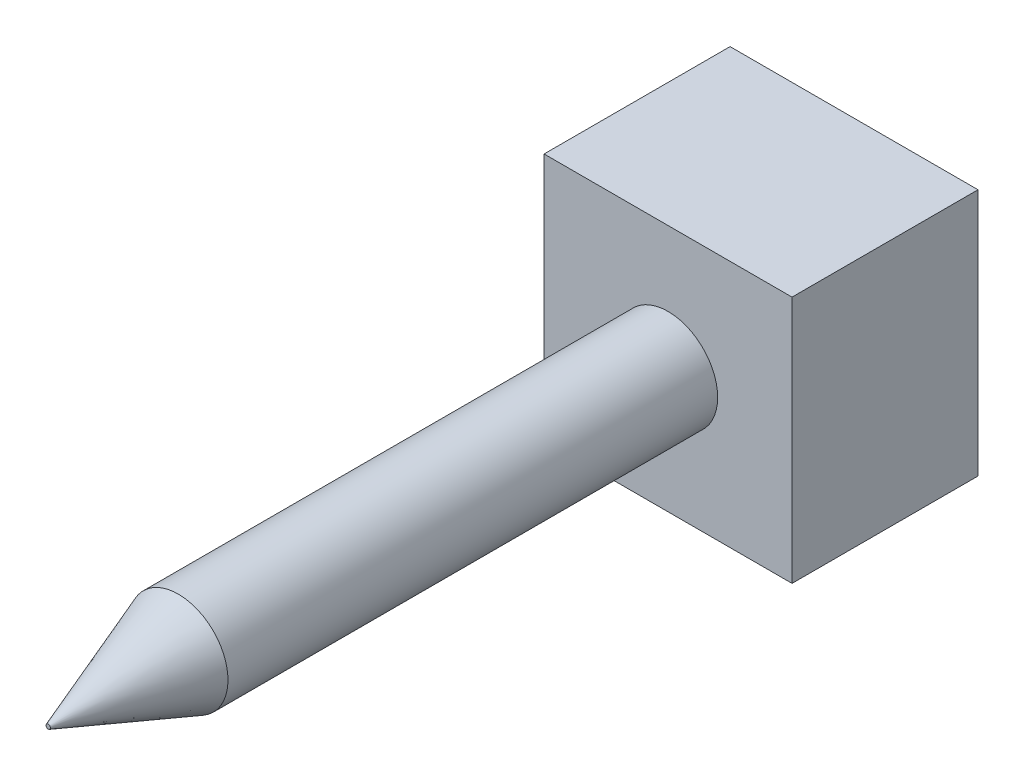
ISO-10303-21;
HEADER;
FILE_DESCRIPTION(('STEP AP214'),'2;1');
FILE_NAME('part.step','',(''),(''),'','','');
FILE_SCHEMA(('AUTOMOTIVE_DESIGN { 1 0 10303 214 1 1 1 1 }'));
ENDSEC;
DATA;
#1=APPLICATION_CONTEXT('core data for automotive mechanical design processes');
#2=APPLICATION_PROTOCOL_DEFINITION('international standard','automotive_design',2000,#1);
#3=PRODUCT_CONTEXT('',#1,'mechanical');
#4=PRODUCT('Part','Part','',(#3));
#5=PRODUCT_RELATED_PRODUCT_CATEGORY('part','',(#4));
#6=PRODUCT_DEFINITION_FORMATION('','',#4);
#7=PRODUCT_DEFINITION_CONTEXT('part definition',#1,'design');
#8=PRODUCT_DEFINITION('design','',#6,#7);
#9=PRODUCT_DEFINITION_SHAPE('','',#8);
#10=(LENGTH_UNIT() NAMED_UNIT(*) SI_UNIT(.MILLI.,.METRE.));
#11=(NAMED_UNIT(*) PLANE_ANGLE_UNIT() SI_UNIT($,.RADIAN.));
#12=(NAMED_UNIT(*) SI_UNIT($,.STERADIAN.) SOLID_ANGLE_UNIT());
#13=UNCERTAINTY_MEASURE_WITH_UNIT(LENGTH_MEASURE(1.E-05),#10,'distance_accuracy_value','');
#14=(GEOMETRIC_REPRESENTATION_CONTEXT(3) GLOBAL_UNCERTAINTY_ASSIGNED_CONTEXT((#13)) GLOBAL_UNIT_ASSIGNED_CONTEXT((#10,
#11,#12)) REPRESENTATION_CONTEXT('',''));
#15=CARTESIAN_POINT('',(0.,0.,0.));
#16=DIRECTION('',(0.,0.,1.));
#17=DIRECTION('',(1.,0.,0.));
#18=AXIS2_PLACEMENT_3D('',#15,#16,#17);
#19=CARTESIAN_POINT('',(10.,10.,15.));
#20=DIRECTION('',(-1.,0.,0.));
#21=DIRECTION('',(0.,0.,1.));
#22=AXIS2_PLACEMENT_3D('',#19,#20,#21);
#23=PLANE('',#22);
#24=DIRECTION('',(0.,1.,0.));
#25=VECTOR('',#24,1.);
#26=CARTESIAN_POINT('',(10.,10.,0.));
#27=LINE('',#26,#25);
#28=CARTESIAN_POINT('',(10.,-10.,0.));
#29=VERTEX_POINT('',#28);
#30=CARTESIAN_POINT('',(10.,10.,0.));
#31=VERTEX_POINT('',#30);
#32=EDGE_CURVE('E104',#29,#31,#27,.T.);
#33=ORIENTED_EDGE('',*,*,#32,.T.);
#34=DIRECTION('',(0.,0.,-1.));
#35=VECTOR('',#34,1.);
#36=CARTESIAN_POINT('',(10.,10.,15.));
#37=LINE('',#36,#35);
#38=CARTESIAN_POINT('',(10.,10.,15.));
#39=VERTEX_POINT('',#38);
#40=EDGE_CURVE('E95',#39,#31,#37,.T.);
#41=ORIENTED_EDGE('',*,*,#40,.F.);
#42=DIRECTION('',(0.,1.,0.));
#43=VECTOR('',#42,1.);
#44=CARTESIAN_POINT('',(10.,10.,15.));
#45=LINE('',#44,#43);
#46=CARTESIAN_POINT('',(10.,-10.,15.));
#47=VERTEX_POINT('',#46);
#48=EDGE_CURVE('E89',#47,#39,#45,.T.);
#49=ORIENTED_EDGE('',*,*,#48,.F.);
#50=DIRECTION('',(0.,0.,-1.));
#51=VECTOR('',#50,1.);
#52=CARTESIAN_POINT('',(10.,-10.,15.));
#53=LINE('',#52,#51);
#54=EDGE_CURVE('E100',#47,#29,#53,.T.);
#55=ORIENTED_EDGE('',*,*,#54,.T.);
#56=EDGE_LOOP('',(#33,#41,#49,#55));
#57=FACE_BOUND('',#56,.T.);
#58=ADVANCED_FACE('F35',(#57),#23,.F.);
#59=CARTESIAN_POINT('',(-10.,10.,15.));
#60=DIRECTION('',(0.,-1.,0.));
#61=DIRECTION('',(0.,0.,-1.));
#62=AXIS2_PLACEMENT_3D('',#59,#60,#61);
#63=PLANE('',#62);
#64=DIRECTION('',(-1.,0.,0.));
#65=VECTOR('',#64,1.);
#66=CARTESIAN_POINT('',(-10.,10.,0.));
#67=LINE('',#66,#65);
#68=CARTESIAN_POINT('',(-10.,10.,0.));
#69=VERTEX_POINT('',#68);
#70=EDGE_CURVE('E94',#31,#69,#67,.T.);
#71=ORIENTED_EDGE('',*,*,#70,.T.);
#72=DIRECTION('',(0.,0.,-1.));
#73=VECTOR('',#72,1.);
#74=CARTESIAN_POINT('',(-10.,10.,15.));
#75=LINE('',#74,#73);
#76=CARTESIAN_POINT('',(-10.,10.,15.));
#77=VERTEX_POINT('',#76);
#78=EDGE_CURVE('E92',#77,#69,#75,.T.);
#79=ORIENTED_EDGE('',*,*,#78,.F.);
#80=DIRECTION('',(-1.,0.,0.));
#81=VECTOR('',#80,1.);
#82=CARTESIAN_POINT('',(-10.,10.,15.));
#83=LINE('',#82,#81);
#84=EDGE_CURVE('E84',#39,#77,#83,.T.);
#85=ORIENTED_EDGE('',*,*,#84,.F.);
#86=ORIENTED_EDGE('',*,*,#40,.T.);
#87=EDGE_LOOP('',(#71,#79,#85,#86));
#88=FACE_BOUND('',#87,.T.);
#89=ADVANCED_FACE('F93',(#88),#63,.F.);
#90=CARTESIAN_POINT('',(-10.,10.,15.));
#91=DIRECTION('',(1.,0.,0.));
#92=DIRECTION('',(0.,0.,-1.));
#93=AXIS2_PLACEMENT_3D('',#90,#91,#92);
#94=PLANE('',#93);
#95=DIRECTION('',(0.,-1.,0.));
#96=VECTOR('',#95,1.);
#97=CARTESIAN_POINT('',(-10.,10.,0.));
#98=LINE('',#97,#96);
#99=CARTESIAN_POINT('',(-10.,-10.,0.));
#100=VERTEX_POINT('',#99);
#101=EDGE_CURVE('E70',#69,#100,#98,.T.);
#102=ORIENTED_EDGE('',*,*,#101,.T.);
#103=DIRECTION('',(0.,0.,-1.));
#104=VECTOR('',#103,1.);
#105=CARTESIAN_POINT('',(-10.,-10.,15.));
#106=LINE('',#105,#104);
#107=CARTESIAN_POINT('',(-10.,-10.,15.));
#108=VERTEX_POINT('',#107);
#109=EDGE_CURVE('E96',#108,#100,#106,.T.);
#110=ORIENTED_EDGE('',*,*,#109,.F.);
#111=DIRECTION('',(0.,-1.,0.));
#112=VECTOR('',#111,1.);
#113=CARTESIAN_POINT('',(-10.,10.,15.));
#114=LINE('',#113,#112);
#115=EDGE_CURVE('E87',#77,#108,#114,.T.);
#116=ORIENTED_EDGE('',*,*,#115,.F.);
#117=ORIENTED_EDGE('',*,*,#78,.T.);
#118=EDGE_LOOP('',(#102,#110,#116,#117));
#119=FACE_BOUND('',#118,.T.);
#120=ADVANCED_FACE('F98',(#119),#94,.F.);
#121=CARTESIAN_POINT('',(-10.,-10.,15.));
#122=DIRECTION('',(0.,1.,0.));
#123=DIRECTION('',(0.,0.,1.));
#124=AXIS2_PLACEMENT_3D('',#121,#122,#123);
#125=PLANE('',#124);
#126=DIRECTION('',(1.,0.,0.));
#127=VECTOR('',#126,1.);
#128=CARTESIAN_POINT('',(-10.,-10.,0.));
#129=LINE('',#128,#127);
#130=EDGE_CURVE('E76',#100,#29,#129,.T.);
#131=ORIENTED_EDGE('',*,*,#130,.T.);
#132=ORIENTED_EDGE('',*,*,#54,.F.);
#133=DIRECTION('',(1.,0.,0.));
#134=VECTOR('',#133,1.);
#135=CARTESIAN_POINT('',(-10.,-10.,15.));
#136=LINE('',#135,#134);
#137=EDGE_CURVE('E53',#108,#47,#136,.T.);
#138=ORIENTED_EDGE('',*,*,#137,.F.);
#139=ORIENTED_EDGE('',*,*,#109,.T.);
#140=EDGE_LOOP('',(#131,#132,#138,#139));
#141=FACE_BOUND('',#140,.T.);
#142=ADVANCED_FACE('F124',(#141),#125,.F.);
#143=CARTESIAN_POINT('',(0.,0.,15.));
#144=DIRECTION('',(0.,0.,1.));
#145=DIRECTION('',(1.,0.,0.));
#146=AXIS2_PLACEMENT_3D('',#143,#144,#145);
#147=PLANE('',#146);
#148=CARTESIAN_POINT('',(0.,0.,15.));
#149=DIRECTION('',(0.,0.,1.));
#150=DIRECTION('',(1.,0.,0.));
#151=AXIS2_PLACEMENT_3D('',#148,#149,#150);
#152=CIRCLE('',#151,4.);
#153=CARTESIAN_POINT('',(4.,0.,15.));
#154=VERTEX_POINT('',#153);
#155=EDGE_CURVE('E112',#154,#154,#152,.T.);
#156=ORIENTED_EDGE('',*,*,#155,.F.);
#157=EDGE_LOOP('',(#156));
#158=FACE_BOUND('',#157,.T.);
#159=ORIENTED_EDGE('',*,*,#48,.T.);
#160=ORIENTED_EDGE('',*,*,#84,.T.);
#161=ORIENTED_EDGE('',*,*,#115,.T.);
#162=ORIENTED_EDGE('',*,*,#137,.T.);
#163=EDGE_LOOP('',(#159,#160,#161,#162));
#164=FACE_BOUND('',#163,.T.);
#165=ADVANCED_FACE('F85',(#158,#164),#147,.T.);
#166=CARTESIAN_POINT('',(0.,0.,0.));
#167=DIRECTION('',(0.,0.,1.));
#168=DIRECTION('',(1.,0.,0.));
#169=AXIS2_PLACEMENT_3D('',#166,#167,#168);
#170=PLANE('',#169);
#171=ORIENTED_EDGE('',*,*,#32,.F.);
#172=ORIENTED_EDGE('',*,*,#130,.F.);
#173=ORIENTED_EDGE('',*,*,#101,.F.);
#174=ORIENTED_EDGE('',*,*,#70,.F.);
#175=EDGE_LOOP('',(#171,#172,#173,#174));
#176=FACE_BOUND('',#175,.T.);
#177=ADVANCED_FACE('F123',(#176),#170,.F.);
#178=CARTESIAN_POINT('',(0.,0.,65.));
#179=DIRECTION('',(0.,0.,-1.));
#180=DIRECTION('',(-1.,0.,0.));
#181=AXIS2_PLACEMENT_3D('',#178,#179,#180);
#182=CYLINDRICAL_SURFACE('',#181,4.);
#183=CARTESIAN_POINT('',(0.,0.,54.4999999999999));
#184=DIRECTION('',(0.,0.,1.));
#185=DIRECTION('',(1.,0.,0.));
#186=AXIS2_PLACEMENT_3D('',#183,#184,#185);
#187=CIRCLE('',#186,4.);
#188=CARTESIAN_POINT('',(-4.,0.,54.4999999999999));
#189=VERTEX_POINT('',#188);
#190=EDGE_CURVE('E11',#189,#189,#187,.F.);
#191=ORIENTED_EDGE('',*,*,#190,.T.);
#192=EDGE_LOOP('',(#191));
#193=FACE_BOUND('',#192,.T.);
#194=ORIENTED_EDGE('',*,*,#155,.T.);
#195=EDGE_LOOP('',(#194));
#196=FACE_BOUND('',#195,.T.);
#197=ADVANCED_FACE('F120',(#193,#196),#182,.T.);
#198=CARTESIAN_POINT('',(0.,0.,65.));
#199=DIRECTION('',(0.,0.,1.));
#200=DIRECTION('',(1.,0.,0.));
#201=AXIS2_PLACEMENT_3D('',#198,#199,#200);
#202=PLANE('',#201);
#203=CARTESIAN_POINT('',(0.,0.,65.));
#204=DIRECTION('',(0.,0.,1.));
#205=DIRECTION('',(1.,0.,0.));
#206=AXIS2_PLACEMENT_3D('',#203,#204,#205);
#207=CIRCLE('',#206,0.17831254020487);
#208=CARTESIAN_POINT('',(-0.178312540204873,0.,65.));
#209=VERTEX_POINT('',#208);
#210=EDGE_CURVE('E45',#209,#209,#207,.T.);
#211=ORIENTED_EDGE('',*,*,#210,.T.);
#212=EDGE_LOOP('',(#211));
#213=FACE_BOUND('',#212,.T.);
#214=ADVANCED_FACE('F169',(#213),#202,.T.);
#215=CARTESIAN_POINT('',(0.,0.,65.));
#216=DIRECTION('',(0.,0.,-1.));
#217=DIRECTION('',(-1.,0.,0.));
#218=AXIS2_PLACEMENT_3D('',#215,#216,#217);
#219=CONICAL_SURFACE('',#218,0.17831254020487,0.349065850398864);
#220=CARTESIAN_POINT('',(-4.,0.,54.4999999999999));
#221=CARTESIAN_POINT('',(-3.96019075562714,0.,54.6093749999999));
#222=CARTESIAN_POINT('',(-3.92038151125427,0.,54.7187499999999));
#223=CARTESIAN_POINT('',(-3.84076302250854,0.,54.9374999999999));
#224=CARTESIAN_POINT('',(-3.80095377813567,0.,55.0468749999999));
#225=CARTESIAN_POINT('',(-3.72133528938994,0.,55.2656249999999));
#226=CARTESIAN_POINT('',(-3.68152604501707,0.,55.3749999999999));
#227=CARTESIAN_POINT('',(-3.60190755627134,0.,55.5937499999999));
#228=CARTESIAN_POINT('',(-3.56209831189848,0.,55.7031249999999));
#229=CARTESIAN_POINT('',(-3.48247982315274,0.,55.9218749999999));
#230=CARTESIAN_POINT('',(-3.44267057877988,0.,56.0312499999999));
#231=CARTESIAN_POINT('',(-3.36305209003415,0.,56.2499999999999));
#232=CARTESIAN_POINT('',(-3.32324284566128,0.,56.3593749999999));
#233=CARTESIAN_POINT('',(-3.24362435691555,0.,56.5781249999999));
#234=CARTESIAN_POINT('',(-3.20381511254268,0.,56.6874999999999));
#235=CARTESIAN_POINT('',(-3.12419662379695,0.,56.9062499999999));
#236=CARTESIAN_POINT('',(-3.08438737942409,0.,57.0156249999999));
#237=CARTESIAN_POINT('',(-3.00476889067835,0.,57.2343749999999));
#238=CARTESIAN_POINT('',(-2.96495964630549,0.,57.3437499999999));
#239=CARTESIAN_POINT('',(-2.88534115755976,0.,57.5624999999999));
#240=CARTESIAN_POINT('',(-2.84553191318689,0.,57.6718749999999));
#241=CARTESIAN_POINT('',(-2.76591342444116,0.,57.8906249999999));
#242=CARTESIAN_POINT('',(-2.72610418006829,0.,58.));
#243=CARTESIAN_POINT('',(-2.64648569132256,0.,58.21875));
#244=CARTESIAN_POINT('',(-2.60667644694969,0.,58.3281249999999));
#245=CARTESIAN_POINT('',(-2.52705795820396,0.,58.546875));
#246=CARTESIAN_POINT('',(-2.4872487138311,0.,58.65625));
#247=CARTESIAN_POINT('',(-2.40763022508536,0.,58.875));
#248=CARTESIAN_POINT('',(-2.3678209807125,0.,58.984375));
#249=CARTESIAN_POINT('',(-2.28820249196677,0.,59.203125));
#250=CARTESIAN_POINT('',(-2.2483932475939,0.,59.3125));
#251=CARTESIAN_POINT('',(-2.16877475884817,0.,59.53125));
#252=CARTESIAN_POINT('',(-2.1289655144753,0.,59.640625));
#253=CARTESIAN_POINT('',(-2.04934702572957,0.,59.859375));
#254=CARTESIAN_POINT('',(-2.00953778135671,0.,59.96875));
#255=CARTESIAN_POINT('',(-1.92991929261097,0.,60.1875));
#256=CARTESIAN_POINT('',(-1.89011004823811,0.,60.296875));
#257=CARTESIAN_POINT('',(-1.81049155949238,0.,60.515625));
#258=CARTESIAN_POINT('',(-1.77068231511951,0.,60.625));
#259=CARTESIAN_POINT('',(-1.69106382637378,0.,60.84375));
#260=CARTESIAN_POINT('',(-1.65125458200091,0.,60.953125));
#261=CARTESIAN_POINT('',(-1.57163609325518,0.,61.171875));
#262=CARTESIAN_POINT('',(-1.53182684888231,0.,61.28125));
#263=CARTESIAN_POINT('',(-1.45220836013658,0.,61.5));
#264=CARTESIAN_POINT('',(-1.41239911576372,0.,61.609375));
#265=CARTESIAN_POINT('',(-1.33278062701798,0.,61.828125));
#266=CARTESIAN_POINT('',(-1.29297138264512,0.,61.9375));
#267=CARTESIAN_POINT('',(-1.21335289389939,0.,62.15625));
#268=CARTESIAN_POINT('',(-1.17354364952652,0.,62.265625));
#269=CARTESIAN_POINT('',(-1.09392516078079,0.,62.484375));
#270=CARTESIAN_POINT('',(-1.05411591640792,0.,62.59375));
#271=CARTESIAN_POINT('',(-0.974497427662192,0.,62.8125));
#272=CARTESIAN_POINT('',(-0.934688183289325,0.,62.921875));
#273=CARTESIAN_POINT('',(-0.855069694543593,0.,63.140625));
#274=CARTESIAN_POINT('',(-0.815260450170728,0.,63.25));
#275=CARTESIAN_POINT('',(-0.735641961424996,0.,63.46875));
#276=CARTESIAN_POINT('',(-0.695832717052129,0.,63.578125));
#277=CARTESIAN_POINT('',(-0.616214228306398,0.,63.796875));
#278=CARTESIAN_POINT('',(-0.576404983933533,0.,63.90625));
#279=CARTESIAN_POINT('',(-0.496786495187801,0.,64.125));
#280=CARTESIAN_POINT('',(-0.456977250814935,0.,64.234375));
#281=CARTESIAN_POINT('',(-0.377358762069202,0.,64.453125));
#282=CARTESIAN_POINT('',(-0.337549517696336,0.,64.5625));
#283=CARTESIAN_POINT('',(-0.257931028950604,0.,64.78125));
#284=CARTESIAN_POINT('',(-0.218121784577738,0.,64.890625));
#285=CARTESIAN_POINT('',(-0.178312540204873,0.,65.));
#286=B_SPLINE_CURVE_WITH_KNOTS('',3,(#220,#221,#222,#223,#224,#225,#226,#227,#228,#229,#230,
#231,#232,#233,#234,#235,#236,#237,#238,#239,#240,#241,#242,#243,#244,#245,#246,#247,#248,#249,
#250,#251,#252,#253,#254,#255,#256,#257,#258,#259,#260,#261,#262,#263,#264,#265,#266,#267,#268,
#269,#270,#271,#272,#273,#274,#275,#276,#277,#278,#279,#280,#281,#282,#283,#284,#285),
.UNSPECIFIED.,.F.,.F.,(4,2,2,2,2,2,2,2,2,2,2,2,2,2,2,2,2,2,2,2,2,2,2,2,2,2,2,2,2,2,2,2,4),(0.,
0.349183331593657,0.698366663187315,1.04754999478098,1.39673332637464,1.7459166579683,
2.09509998956196,2.44428332115562,2.79346665274929,3.14264998434294,3.49183331593661,
3.84101664753027,4.19019997912393,4.53938331071759,4.88856664231125,5.23774997390491,
5.58693330549857,5.93611663709223,6.28529996868589,6.63448330027955,6.98366663187321,
7.33284996346688,7.68203329506054,8.0312166266542,8.38039995824785,8.72958328984152,
9.07876662143518,9.42794995302884,9.77713328462249,10.1263166162162,10.4754999478098,
10.8246832794035,11.1738666109972),.UNSPECIFIED.);
#287=EDGE_CURVE('BSEAM38',#189,#209,#286,.T.);
#288=ORIENTED_EDGE('',*,*,#190,.F.);
#289=ORIENTED_EDGE('',*,*,#210,.F.);
#290=ORIENTED_EDGE('',*,*,#287,.T.);
#291=ORIENTED_EDGE('',*,*,#287,.F.);
#292=EDGE_LOOP('',(#288,#290,#289,#291));
#293=FACE_BOUND('',#292,.T.);
#294=ADVANCED_FACE('F38',(#293),#219,.T.);
#295=CLOSED_SHELL('',(#58,#89,#120,#142,#165,#177,#197,#214,#294));
#296=MANIFOLD_SOLID_BREP('B2',#295);
#297=ADVANCED_BREP_SHAPE_REPRESENTATION('',(#18,#296),#14);
#298=SHAPE_DEFINITION_REPRESENTATION(#9,#297);
ENDSEC;
END-ISO-10303-21;
